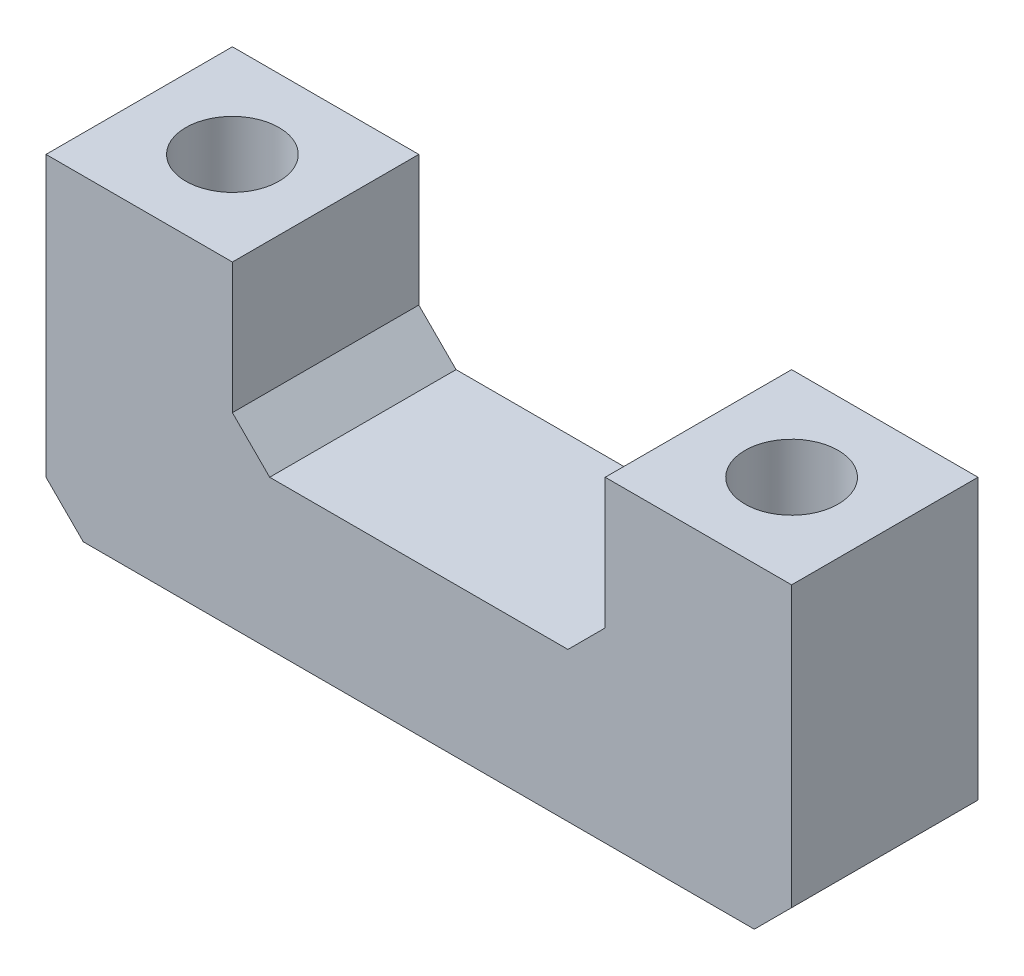
ISO-10303-21;
HEADER;
FILE_DESCRIPTION(('STEP AP214'),'2;1');
FILE_NAME('part.step','',(''),(''),'','','');
FILE_SCHEMA(('AUTOMOTIVE_DESIGN { 1 0 10303 214 1 1 1 1 }'));
ENDSEC;
DATA;
#1=APPLICATION_CONTEXT('core data for automotive mechanical design processes');
#2=APPLICATION_PROTOCOL_DEFINITION('international standard','automotive_design',2000,#1);
#3=PRODUCT_CONTEXT('',#1,'mechanical');
#4=PRODUCT('Part','Part','',(#3));
#5=PRODUCT_RELATED_PRODUCT_CATEGORY('part','',(#4));
#6=PRODUCT_DEFINITION_FORMATION('','',#4);
#7=PRODUCT_DEFINITION_CONTEXT('part definition',#1,'design');
#8=PRODUCT_DEFINITION('design','',#6,#7);
#9=PRODUCT_DEFINITION_SHAPE('','',#8);
#10=(LENGTH_UNIT() NAMED_UNIT(*) SI_UNIT(.MILLI.,.METRE.));
#11=(NAMED_UNIT(*) PLANE_ANGLE_UNIT() SI_UNIT($,.RADIAN.));
#12=(NAMED_UNIT(*) SI_UNIT($,.STERADIAN.) SOLID_ANGLE_UNIT());
#13=UNCERTAINTY_MEASURE_WITH_UNIT(LENGTH_MEASURE(1.E-05),#10,'distance_accuracy_value','');
#14=(GEOMETRIC_REPRESENTATION_CONTEXT(3) GLOBAL_UNCERTAINTY_ASSIGNED_CONTEXT((#13)) GLOBAL_UNIT_ASSIGNED_CONTEXT((#10,
#11,#12)) REPRESENTATION_CONTEXT('',''));
#15=CARTESIAN_POINT('',(0.,0.,0.));
#16=DIRECTION('',(0.,0.,1.));
#17=DIRECTION('',(1.,0.,0.));
#18=AXIS2_PLACEMENT_3D('',#15,#16,#17);
#19=CARTESIAN_POINT('',(5.,-4.5,2.5));
#20=DIRECTION('',(1.,0.,0.));
#21=DIRECTION('',(0.,1.,0.));
#22=AXIS2_PLACEMENT_3D('',#19,#20,#21);
#23=PLANE('',#22);
#24=DIRECTION('',(0.,-1.,0.));
#25=VECTOR('',#24,1.);
#26=CARTESIAN_POINT('',(5.,-4.5,-2.5));
#27=LINE('',#26,#25);
#28=CARTESIAN_POINT('',(5.,0.,-2.5));
#29=VERTEX_POINT('',#28);
#30=CARTESIAN_POINT('',(5.,-3.50000000000001,-2.5));
#31=VERTEX_POINT('',#30);
#32=EDGE_CURVE('E164',#29,#31,#27,.T.);
#33=ORIENTED_EDGE('',*,*,#32,.T.);
#34=DIRECTION('',(0.,0.,1.));
#35=VECTOR('',#34,1.);
#36=CARTESIAN_POINT('',(5.,-3.50000000000001,2.5));
#37=LINE('',#36,#35);
#38=CARTESIAN_POINT('',(5.,-3.50000000000001,2.5));
#39=VERTEX_POINT('',#38);
#40=EDGE_CURVE('E193',#31,#39,#37,.T.);
#41=ORIENTED_EDGE('',*,*,#40,.T.);
#42=DIRECTION('',(0.,-1.,0.));
#43=VECTOR('',#42,1.);
#44=CARTESIAN_POINT('',(5.,-4.5,2.5));
#45=LINE('',#44,#43);
#46=CARTESIAN_POINT('',(5.,0.,2.5));
#47=VERTEX_POINT('',#46);
#48=EDGE_CURVE('E182',#47,#39,#45,.T.);
#49=ORIENTED_EDGE('',*,*,#48,.F.);
#50=DIRECTION('',(0.,0.,-1.));
#51=VECTOR('',#50,1.);
#52=CARTESIAN_POINT('',(5.,0.,2.5));
#53=LINE('',#52,#51);
#54=EDGE_CURVE('E163',#47,#29,#53,.T.);
#55=ORIENTED_EDGE('',*,*,#54,.T.);
#56=EDGE_LOOP('',(#33,#41,#49,#55));
#57=FACE_BOUND('',#56,.T.);
#58=ADVANCED_FACE('F36',(#57),#23,.F.);
#59=CARTESIAN_POINT('',(-5.,-4.5,2.5));
#60=DIRECTION('',(0.,-1.,0.));
#61=DIRECTION('',(0.,0.,-1.));
#62=AXIS2_PLACEMENT_3D('',#59,#60,#61);
#63=PLANE('',#62);
#64=DIRECTION('',(-1.,0.,0.));
#65=VECTOR('',#64,1.);
#66=CARTESIAN_POINT('',(-5.,-4.5,2.5));
#67=LINE('',#66,#65);
#68=CARTESIAN_POINT('',(4.,-4.5,2.5));
#69=VERTEX_POINT('',#68);
#70=CARTESIAN_POINT('',(-4.00000000000001,-4.5,2.5));
#71=VERTEX_POINT('',#70);
#72=EDGE_CURVE('E138',#69,#71,#67,.T.);
#73=ORIENTED_EDGE('',*,*,#72,.F.);
#74=DIRECTION('',(0.,0.,-1.));
#75=VECTOR('',#74,1.);
#76=CARTESIAN_POINT('',(4.,-4.5,-2.5));
#77=LINE('',#76,#75);
#78=CARTESIAN_POINT('',(4.,-4.5,-2.5));
#79=VERTEX_POINT('',#78);
#80=EDGE_CURVE('E190',#69,#79,#77,.T.);
#81=ORIENTED_EDGE('',*,*,#80,.T.);
#82=DIRECTION('',(-1.,0.,0.));
#83=VECTOR('',#82,1.);
#84=CARTESIAN_POINT('',(-5.,-4.5,-2.5));
#85=LINE('',#84,#83);
#86=CARTESIAN_POINT('',(-4.00000000000001,-4.5,-2.5));
#87=VERTEX_POINT('',#86);
#88=EDGE_CURVE('E167',#79,#87,#85,.T.);
#89=ORIENTED_EDGE('',*,*,#88,.T.);
#90=DIRECTION('',(0.,0.,1.));
#91=VECTOR('',#90,1.);
#92=CARTESIAN_POINT('',(-4.00000000000001,-4.5,2.5));
#93=LINE('',#92,#91);
#94=EDGE_CURVE('E147',#87,#71,#93,.T.);
#95=ORIENTED_EDGE('',*,*,#94,.T.);
#96=EDGE_LOOP('',(#73,#81,#89,#95));
#97=FACE_BOUND('',#96,.T.);
#98=ADVANCED_FACE('F224',(#97),#63,.F.);
#99=CARTESIAN_POINT('',(-5.,-4.5,2.5));
#100=DIRECTION('',(-1.,0.,0.));
#101=DIRECTION('',(0.,-1.,0.));
#102=AXIS2_PLACEMENT_3D('',#99,#100,#101);
#103=PLANE('',#102);
#104=DIRECTION('',(0.,1.,0.));
#105=VECTOR('',#104,1.);
#106=CARTESIAN_POINT('',(-5.,-4.5,2.5));
#107=LINE('',#106,#105);
#108=CARTESIAN_POINT('',(-5.,-3.5,2.5));
#109=VERTEX_POINT('',#108);
#110=CARTESIAN_POINT('',(-4.99999999999999,0.,2.5));
#111=VERTEX_POINT('',#110);
#112=EDGE_CURVE('E127',#109,#111,#107,.T.);
#113=ORIENTED_EDGE('',*,*,#112,.F.);
#114=DIRECTION('',(0.,0.,-1.));
#115=VECTOR('',#114,1.);
#116=CARTESIAN_POINT('',(-5.,-3.5,-2.5));
#117=LINE('',#116,#115);
#118=CARTESIAN_POINT('',(-5.,-3.5,-2.5));
#119=VERTEX_POINT('',#118);
#120=EDGE_CURVE('E195',#109,#119,#117,.T.);
#121=ORIENTED_EDGE('',*,*,#120,.T.);
#122=DIRECTION('',(0.,1.,0.));
#123=VECTOR('',#122,1.);
#124=CARTESIAN_POINT('',(-5.,-4.5,-2.5));
#125=LINE('',#124,#123);
#126=CARTESIAN_POINT('',(-4.99999999999999,0.,-2.5));
#127=VERTEX_POINT('',#126);
#128=EDGE_CURVE('E144',#119,#127,#125,.T.);
#129=ORIENTED_EDGE('',*,*,#128,.T.);
#130=DIRECTION('',(0.,0.,-1.));
#131=VECTOR('',#130,1.);
#132=CARTESIAN_POINT('',(-4.99999999999999,0.,2.5));
#133=LINE('',#132,#131);
#134=EDGE_CURVE('E141',#111,#127,#133,.T.);
#135=ORIENTED_EDGE('',*,*,#134,.F.);
#136=EDGE_LOOP('',(#113,#121,#129,#135));
#137=FACE_BOUND('',#136,.T.);
#138=ADVANCED_FACE('F142',(#137),#103,.F.);
#139=CARTESIAN_POINT('',(-4.99999999999999,0.,2.5));
#140=DIRECTION('',(0.,-1.,0.));
#141=DIRECTION('',(1.,0.,0.));
#142=AXIS2_PLACEMENT_3D('',#139,#140,#141);
#143=PLANE('',#142);
#144=CARTESIAN_POINT('',(-7.5,0.,0.));
#145=DIRECTION('',(0.,-1.,0.));
#146=DIRECTION('',(0.,0.,-1.));
#147=AXIS2_PLACEMENT_3D('',#144,#145,#146);
#148=CIRCLE('',#147,1.25);
#149=CARTESIAN_POINT('',(-7.5,0.,-1.25));
#150=VERTEX_POINT('',#149);
#151=EDGE_CURVE('E282',#150,#150,#148,.T.);
#152=ORIENTED_EDGE('',*,*,#151,.T.);
#153=EDGE_LOOP('',(#152));
#154=FACE_BOUND('',#153,.T.);
#155=DIRECTION('',(-1.,0.,0.));
#156=VECTOR('',#155,1.);
#157=CARTESIAN_POINT('',(-4.99999999999999,0.,-2.5));
#158=LINE('',#157,#156);
#159=CARTESIAN_POINT('',(-10.,0.,-2.5));
#160=VERTEX_POINT('',#159);
#161=EDGE_CURVE('E172',#127,#160,#158,.T.);
#162=ORIENTED_EDGE('',*,*,#161,.T.);
#163=DIRECTION('',(0.,0.,-1.));
#164=VECTOR('',#163,1.);
#165=CARTESIAN_POINT('',(-10.,0.,2.5));
#166=LINE('',#165,#164);
#167=CARTESIAN_POINT('',(-10.,0.,2.5));
#168=VERTEX_POINT('',#167);
#169=EDGE_CURVE('E148',#168,#160,#166,.T.);
#170=ORIENTED_EDGE('',*,*,#169,.F.);
#171=DIRECTION('',(-1.,0.,0.));
#172=VECTOR('',#171,1.);
#173=CARTESIAN_POINT('',(-4.99999999999999,0.,2.5));
#174=LINE('',#173,#172);
#175=EDGE_CURVE('E131',#111,#168,#174,.T.);
#176=ORIENTED_EDGE('',*,*,#175,.F.);
#177=ORIENTED_EDGE('',*,*,#134,.T.);
#178=EDGE_LOOP('',(#162,#170,#176,#177));
#179=FACE_BOUND('',#178,.T.);
#180=ADVANCED_FACE('F150',(#154,#179),#143,.F.);
#181=CARTESIAN_POINT('',(-10.,0.,2.5));
#182=DIRECTION('',(1.,0.,0.));
#183=DIRECTION('',(0.,1.,0.));
#184=AXIS2_PLACEMENT_3D('',#181,#182,#183);
#185=PLANE('',#184);
#186=DIRECTION('',(0.,-1.,0.));
#187=VECTOR('',#186,1.);
#188=CARTESIAN_POINT('',(-10.,0.,-2.5));
#189=LINE('',#188,#187);
#190=CARTESIAN_POINT('',(-9.99999999999999,-7.5,-2.5));
#191=VERTEX_POINT('',#190);
#192=EDGE_CURVE('E174',#160,#191,#189,.T.);
#193=ORIENTED_EDGE('',*,*,#192,.T.);
#194=DIRECTION('',(0.,0.,1.));
#195=VECTOR('',#194,1.);
#196=CARTESIAN_POINT('',(-9.99999999999999,-7.5,2.5));
#197=LINE('',#196,#195);
#198=CARTESIAN_POINT('',(-9.99999999999999,-7.5,2.5));
#199=VERTEX_POINT('',#198);
#200=EDGE_CURVE('E51',#191,#199,#197,.T.);
#201=ORIENTED_EDGE('',*,*,#200,.T.);
#202=DIRECTION('',(0.,-1.,0.));
#203=VECTOR('',#202,1.);
#204=CARTESIAN_POINT('',(-10.,0.,2.5));
#205=LINE('',#204,#203);
#206=EDGE_CURVE('E152',#168,#199,#205,.T.);
#207=ORIENTED_EDGE('',*,*,#206,.F.);
#208=ORIENTED_EDGE('',*,*,#169,.T.);
#209=EDGE_LOOP('',(#193,#201,#207,#208));
#210=FACE_BOUND('',#209,.T.);
#211=ADVANCED_FACE('F251',(#210),#185,.F.);
#212=CARTESIAN_POINT('',(10.,-8.5,2.5));
#213=DIRECTION('',(0.,1.,0.));
#214=DIRECTION('',(-1.,0.,0.));
#215=AXIS2_PLACEMENT_3D('',#212,#213,#214);
#216=PLANE('',#215);
#217=CARTESIAN_POINT('',(-7.5,-8.5,0.));
#218=DIRECTION('',(0.,-1.,0.));
#219=DIRECTION('',(0.,0.,-1.));
#220=AXIS2_PLACEMENT_3D('',#217,#218,#219);
#221=CIRCLE('',#220,1.25);
#222=CARTESIAN_POINT('',(-7.5,-8.5,-1.25));
#223=VERTEX_POINT('',#222);
#224=EDGE_CURVE('E285',#223,#223,#221,.T.);
#225=ORIENTED_EDGE('',*,*,#224,.F.);
#226=EDGE_LOOP('',(#225));
#227=FACE_BOUND('',#226,.T.);
#228=CARTESIAN_POINT('',(7.5,-8.5,0.));
#229=DIRECTION('',(0.,-1.,0.));
#230=DIRECTION('',(0.,0.,-1.));
#231=AXIS2_PLACEMENT_3D('',#228,#229,#230);
#232=CIRCLE('',#231,1.25);
#233=CARTESIAN_POINT('',(7.5,-8.5,-1.25));
#234=VERTEX_POINT('',#233);
#235=EDGE_CURVE('E287',#234,#234,#232,.T.);
#236=ORIENTED_EDGE('',*,*,#235,.F.);
#237=EDGE_LOOP('',(#236));
#238=FACE_BOUND('',#237,.T.);
#239=DIRECTION('',(1.,0.,0.));
#240=VECTOR('',#239,1.);
#241=CARTESIAN_POINT('',(10.,-8.5,-2.5));
#242=LINE('',#241,#240);
#243=CARTESIAN_POINT('',(-9.,-8.5,-2.5));
#244=VERTEX_POINT('',#243);
#245=CARTESIAN_POINT('',(8.99999999999999,-8.5,-2.5));
#246=VERTEX_POINT('',#245);
#247=EDGE_CURVE('E176',#244,#246,#242,.T.);
#248=ORIENTED_EDGE('',*,*,#247,.T.);
#249=DIRECTION('',(0.,0.,1.));
#250=VECTOR('',#249,1.);
#251=CARTESIAN_POINT('',(8.99999999999999,-8.5,2.5));
#252=LINE('',#251,#250);
#253=CARTESIAN_POINT('',(8.99999999999999,-8.5,2.5));
#254=VERTEX_POINT('',#253);
#255=EDGE_CURVE('E59',#246,#254,#252,.T.);
#256=ORIENTED_EDGE('',*,*,#255,.T.);
#257=DIRECTION('',(1.,0.,0.));
#258=VECTOR('',#257,1.);
#259=CARTESIAN_POINT('',(10.,-8.5,2.5));
#260=LINE('',#259,#258);
#261=CARTESIAN_POINT('',(-9.,-8.5,2.5));
#262=VERTEX_POINT('',#261);
#263=EDGE_CURVE('E154',#262,#254,#260,.T.);
#264=ORIENTED_EDGE('',*,*,#263,.F.);
#265=DIRECTION('',(0.,0.,-1.));
#266=VECTOR('',#265,1.);
#267=CARTESIAN_POINT('',(-9.,-8.5,2.5));
#268=LINE('',#267,#266);
#269=EDGE_CURVE('E204',#262,#244,#268,.T.);
#270=ORIENTED_EDGE('',*,*,#269,.T.);
#271=EDGE_LOOP('',(#248,#256,#264,#270));
#272=FACE_BOUND('',#271,.T.);
#273=ADVANCED_FACE('F255',(#227,#238,#272),#216,.F.);
#274=CARTESIAN_POINT('',(10.,0.,2.5));
#275=DIRECTION('',(-1.,0.,0.));
#276=DIRECTION('',(0.,-1.,0.));
#277=AXIS2_PLACEMENT_3D('',#274,#275,#276);
#278=PLANE('',#277);
#279=DIRECTION('',(0.,1.,0.));
#280=VECTOR('',#279,1.);
#281=CARTESIAN_POINT('',(10.,0.,2.5));
#282=LINE('',#281,#280);
#283=CARTESIAN_POINT('',(10.,-7.5,2.5));
#284=VERTEX_POINT('',#283);
#285=CARTESIAN_POINT('',(10.,0.,2.5));
#286=VERTEX_POINT('',#285);
#287=EDGE_CURVE('E159',#284,#286,#282,.T.);
#288=ORIENTED_EDGE('',*,*,#287,.F.);
#289=DIRECTION('',(0.,0.,-1.));
#290=VECTOR('',#289,1.);
#291=CARTESIAN_POINT('',(10.,-7.5,2.5));
#292=LINE('',#291,#290);
#293=CARTESIAN_POINT('',(10.,-7.5,-2.5));
#294=VERTEX_POINT('',#293);
#295=EDGE_CURVE('E197',#284,#294,#292,.T.);
#296=ORIENTED_EDGE('',*,*,#295,.T.);
#297=DIRECTION('',(0.,1.,0.));
#298=VECTOR('',#297,1.);
#299=CARTESIAN_POINT('',(10.,0.,-2.5));
#300=LINE('',#299,#298);
#301=CARTESIAN_POINT('',(10.,0.,-2.5));
#302=VERTEX_POINT('',#301);
#303=EDGE_CURVE('E178',#294,#302,#300,.T.);
#304=ORIENTED_EDGE('',*,*,#303,.T.);
#305=DIRECTION('',(0.,0.,-1.));
#306=VECTOR('',#305,1.);
#307=CARTESIAN_POINT('',(10.,0.,2.5));
#308=LINE('',#307,#306);
#309=EDGE_CURVE('E185',#286,#302,#308,.T.);
#310=ORIENTED_EDGE('',*,*,#309,.F.);
#311=EDGE_LOOP('',(#288,#296,#304,#310));
#312=FACE_BOUND('',#311,.T.);
#313=ADVANCED_FACE('F258',(#312),#278,.F.);
#314=CARTESIAN_POINT('',(5.,0.,2.5));
#315=DIRECTION('',(0.,-1.,0.));
#316=DIRECTION('',(1.,0.,0.));
#317=AXIS2_PLACEMENT_3D('',#314,#315,#316);
#318=PLANE('',#317);
#319=CARTESIAN_POINT('',(7.5,0.,0.));
#320=DIRECTION('',(0.,-1.,0.));
#321=DIRECTION('',(0.,0.,-1.));
#322=AXIS2_PLACEMENT_3D('',#319,#320,#321);
#323=CIRCLE('',#322,1.25);
#324=CARTESIAN_POINT('',(7.5,0.,-1.25));
#325=VERTEX_POINT('',#324);
#326=EDGE_CURVE('E168',#325,#325,#323,.T.);
#327=ORIENTED_EDGE('',*,*,#326,.T.);
#328=EDGE_LOOP('',(#327));
#329=FACE_BOUND('',#328,.T.);
#330=DIRECTION('',(-1.,0.,0.));
#331=VECTOR('',#330,1.);
#332=CARTESIAN_POINT('',(5.,0.,-2.5));
#333=LINE('',#332,#331);
#334=EDGE_CURVE('E180',#302,#29,#333,.T.);
#335=ORIENTED_EDGE('',*,*,#334,.T.);
#336=ORIENTED_EDGE('',*,*,#54,.F.);
#337=DIRECTION('',(-1.,0.,0.));
#338=VECTOR('',#337,1.);
#339=CARTESIAN_POINT('',(5.,0.,2.5));
#340=LINE('',#339,#338);
#341=EDGE_CURVE('E161',#286,#47,#340,.T.);
#342=ORIENTED_EDGE('',*,*,#341,.F.);
#343=ORIENTED_EDGE('',*,*,#309,.T.);
#344=EDGE_LOOP('',(#335,#336,#342,#343));
#345=FACE_BOUND('',#344,.T.);
#346=ADVANCED_FACE('F262',(#329,#345),#318,.F.);
#347=CARTESIAN_POINT('',(0.,0.,2.5));
#348=DIRECTION('',(0.,0.,-1.));
#349=DIRECTION('',(-1.,0.,0.));
#350=AXIS2_PLACEMENT_3D('',#347,#348,#349);
#351=PLANE('',#350);
#352=ORIENTED_EDGE('',*,*,#263,.T.);
#353=DIRECTION('',(-0.707106781186549,-0.707106781186546,0.));
#354=VECTOR('',#353,1.);
#355=CARTESIAN_POINT('',(10.,-7.5,2.5));
#356=LINE('',#355,#354);
#357=EDGE_CURVE('E210',#254,#284,#356,.F.);
#358=ORIENTED_EDGE('',*,*,#357,.T.);
#359=ORIENTED_EDGE('',*,*,#287,.T.);
#360=ORIENTED_EDGE('',*,*,#341,.T.);
#361=ORIENTED_EDGE('',*,*,#48,.T.);
#362=DIRECTION('',(0.707106781186551,0.707106781186544,0.));
#363=VECTOR('',#362,1.);
#364=CARTESIAN_POINT('',(4.24999999999998,-4.25000000000002,2.5));
#365=LINE('',#364,#363);
#366=EDGE_CURVE('E215',#39,#69,#365,.F.);
#367=ORIENTED_EDGE('',*,*,#366,.T.);
#368=ORIENTED_EDGE('',*,*,#72,.T.);
#369=DIRECTION('',(0.707106781186544,-0.707106781186551,0.));
#370=VECTOR('',#369,1.);
#371=CARTESIAN_POINT('',(-4.25000000000003,-4.24999999999998,2.5));
#372=LINE('',#371,#370);
#373=EDGE_CURVE('E11',#71,#109,#372,.F.);
#374=ORIENTED_EDGE('',*,*,#373,.T.);
#375=ORIENTED_EDGE('',*,*,#112,.T.);
#376=ORIENTED_EDGE('',*,*,#175,.T.);
#377=ORIENTED_EDGE('',*,*,#206,.T.);
#378=DIRECTION('',(-0.707106781186544,0.707106781186551,0.));
#379=VECTOR('',#378,1.);
#380=CARTESIAN_POINT('',(-9.,-8.5,2.5));
#381=LINE('',#380,#379);
#382=EDGE_CURVE('E208',#199,#262,#381,.F.);
#383=ORIENTED_EDGE('',*,*,#382,.T.);
#384=EDGE_LOOP('',(#352,#358,#359,#360,#361,#367,#368,#374,#375,#376,#377,#383));
#385=FACE_BOUND('',#384,.T.);
#386=ADVANCED_FACE('F129',(#385),#351,.F.);
#387=CARTESIAN_POINT('',(0.,0.,-2.5));
#388=DIRECTION('',(0.,0.,-1.));
#389=DIRECTION('',(-1.,0.,0.));
#390=AXIS2_PLACEMENT_3D('',#387,#388,#389);
#391=PLANE('',#390);
#392=ORIENTED_EDGE('',*,*,#303,.F.);
#393=DIRECTION('',(0.707106781186549,0.707106781186546,0.));
#394=VECTOR('',#393,1.);
#395=CARTESIAN_POINT('',(8.74999999999998,-8.75000000000001,-2.5));
#396=LINE('',#395,#394);
#397=EDGE_CURVE('E202',#294,#246,#396,.F.);
#398=ORIENTED_EDGE('',*,*,#397,.T.);
#399=ORIENTED_EDGE('',*,*,#247,.F.);
#400=DIRECTION('',(0.707106781186544,-0.707106781186551,0.));
#401=VECTOR('',#400,1.);
#402=CARTESIAN_POINT('',(-8.75000000000005,-8.74999999999996,-2.5));
#403=LINE('',#402,#401);
#404=EDGE_CURVE('E200',#244,#191,#403,.F.);
#405=ORIENTED_EDGE('',*,*,#404,.T.);
#406=ORIENTED_EDGE('',*,*,#192,.F.);
#407=ORIENTED_EDGE('',*,*,#161,.F.);
#408=ORIENTED_EDGE('',*,*,#128,.F.);
#409=DIRECTION('',(-0.707106781186544,0.707106781186551,0.));
#410=VECTOR('',#409,1.);
#411=CARTESIAN_POINT('',(-5.,-3.5,-2.5));
#412=LINE('',#411,#410);
#413=EDGE_CURVE('E44',#119,#87,#412,.F.);
#414=ORIENTED_EDGE('',*,*,#413,.T.);
#415=ORIENTED_EDGE('',*,*,#88,.F.);
#416=DIRECTION('',(-0.707106781186551,-0.707106781186544,0.));
#417=VECTOR('',#416,1.);
#418=CARTESIAN_POINT('',(4.,-4.5,-2.5));
#419=LINE('',#418,#417);
#420=EDGE_CURVE('E213',#79,#31,#419,.F.);
#421=ORIENTED_EDGE('',*,*,#420,.T.);
#422=ORIENTED_EDGE('',*,*,#32,.F.);
#423=ORIENTED_EDGE('',*,*,#334,.F.);
#424=EDGE_LOOP('',(#392,#398,#399,#405,#406,#407,#408,#414,#415,#421,#422,#423));
#425=FACE_BOUND('',#424,.T.);
#426=ADVANCED_FACE('F219',(#425),#391,.T.);
#427=CARTESIAN_POINT('',(7.5,-8.5,0.));
#428=DIRECTION('',(0.,-1.,0.));
#429=DIRECTION('',(0.,0.,-1.));
#430=AXIS2_PLACEMENT_3D('',#427,#428,#429);
#431=CYLINDRICAL_SURFACE('',#430,1.25);
#432=ORIENTED_EDGE('',*,*,#326,.F.);
#433=EDGE_LOOP('',(#432));
#434=FACE_BOUND('',#433,.T.);
#435=ORIENTED_EDGE('',*,*,#235,.T.);
#436=EDGE_LOOP('',(#435));
#437=FACE_BOUND('',#436,.T.);
#438=ADVANCED_FACE('F269',(#434,#437),#431,.F.);
#439=CARTESIAN_POINT('',(-7.5,-8.5,0.));
#440=DIRECTION('',(0.,-1.,0.));
#441=DIRECTION('',(0.,0.,-1.));
#442=AXIS2_PLACEMENT_3D('',#439,#440,#441);
#443=CYLINDRICAL_SURFACE('',#442,1.25);
#444=ORIENTED_EDGE('',*,*,#151,.F.);
#445=EDGE_LOOP('',(#444));
#446=FACE_BOUND('',#445,.T.);
#447=ORIENTED_EDGE('',*,*,#224,.T.);
#448=EDGE_LOOP('',(#447));
#449=FACE_BOUND('',#448,.T.);
#450=ADVANCED_FACE('F236',(#446,#449),#443,.F.);
#451=CARTESIAN_POINT('',(4.,-4.5,2.5));
#452=DIRECTION('',(-0.707106781186544,0.707106781186551,0.));
#453=DIRECTION('',(0.,0.,1.));
#454=AXIS2_PLACEMENT_3D('',#451,#452,#453);
#455=PLANE('',#454);
#456=ORIENTED_EDGE('',*,*,#366,.F.);
#457=ORIENTED_EDGE('',*,*,#40,.F.);
#458=ORIENTED_EDGE('',*,*,#420,.F.);
#459=ORIENTED_EDGE('',*,*,#80,.F.);
#460=EDGE_LOOP('',(#456,#457,#458,#459));
#461=FACE_BOUND('',#460,.T.);
#462=ADVANCED_FACE('F229',(#461),#455,.T.);
#463=CARTESIAN_POINT('',(-5.,-3.5,2.5));
#464=DIRECTION('',(0.707106781186551,0.707106781186544,0.));
#465=DIRECTION('',(0.,0.,1.));
#466=AXIS2_PLACEMENT_3D('',#463,#464,#465);
#467=PLANE('',#466);
#468=ORIENTED_EDGE('',*,*,#373,.F.);
#469=ORIENTED_EDGE('',*,*,#94,.F.);
#470=ORIENTED_EDGE('',*,*,#413,.F.);
#471=ORIENTED_EDGE('',*,*,#120,.F.);
#472=EDGE_LOOP('',(#468,#469,#470,#471));
#473=FACE_BOUND('',#472,.T.);
#474=ADVANCED_FACE('F226',(#473),#467,.T.);
#475=CARTESIAN_POINT('',(10.,-7.5,2.5));
#476=DIRECTION('',(-0.707106781186546,0.707106781186549,0.));
#477=DIRECTION('',(0.,0.,-1.));
#478=AXIS2_PLACEMENT_3D('',#475,#476,#477);
#479=PLANE('',#478);
#480=ORIENTED_EDGE('',*,*,#357,.F.);
#481=ORIENTED_EDGE('',*,*,#255,.F.);
#482=ORIENTED_EDGE('',*,*,#397,.F.);
#483=ORIENTED_EDGE('',*,*,#295,.F.);
#484=EDGE_LOOP('',(#480,#481,#482,#483));
#485=FACE_BOUND('',#484,.T.);
#486=ADVANCED_FACE('F228',(#485),#479,.F.);
#487=CARTESIAN_POINT('',(-9.,-8.5,2.5));
#488=DIRECTION('',(0.707106781186551,0.707106781186544,0.));
#489=DIRECTION('',(0.,0.,-1.));
#490=AXIS2_PLACEMENT_3D('',#487,#488,#489);
#491=PLANE('',#490);
#492=ORIENTED_EDGE('',*,*,#382,.F.);
#493=ORIENTED_EDGE('',*,*,#200,.F.);
#494=ORIENTED_EDGE('',*,*,#404,.F.);
#495=ORIENTED_EDGE('',*,*,#269,.F.);
#496=EDGE_LOOP('',(#492,#493,#494,#495));
#497=FACE_BOUND('',#496,.T.);
#498=ADVANCED_FACE('F38',(#497),#491,.F.);
#499=CLOSED_SHELL('',(#58,#98,#138,#180,#211,#273,#313,#346,#386,#426,#438,#450,#462,#474,#486,#498));
#500=MANIFOLD_SOLID_BREP('B2',#499);
#501=ADVANCED_BREP_SHAPE_REPRESENTATION('',(#18,#500),#14);
#502=SHAPE_DEFINITION_REPRESENTATION(#9,#501);
ENDSEC;
END-ISO-10303-21;
